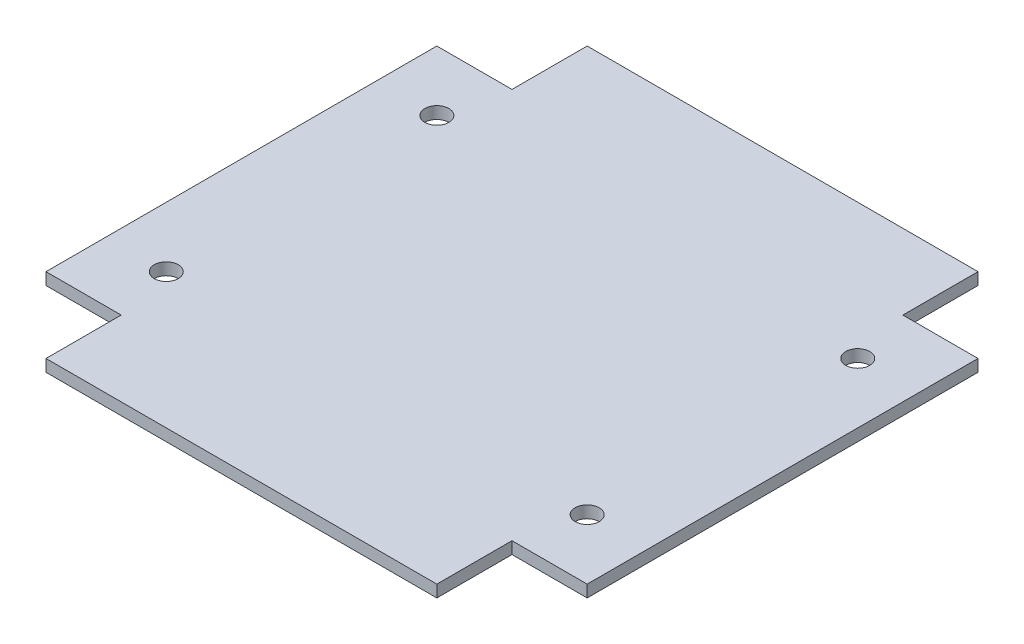
ISO-10303-21;
HEADER;
FILE_DESCRIPTION(('STEP AP214'),'2;1');
FILE_NAME('part.step','',(''),(''),'','','');
FILE_SCHEMA(('AUTOMOTIVE_DESIGN { 1 0 10303 214 1 1 1 1 }'));
ENDSEC;
DATA;
#1=APPLICATION_CONTEXT('core data for automotive mechanical design processes');
#2=APPLICATION_PROTOCOL_DEFINITION('international standard','automotive_design',2000,#1);
#3=PRODUCT_CONTEXT('',#1,'mechanical');
#4=PRODUCT('Part','Part','',(#3));
#5=PRODUCT_RELATED_PRODUCT_CATEGORY('part','',(#4));
#6=PRODUCT_DEFINITION_FORMATION('','',#4);
#7=PRODUCT_DEFINITION_CONTEXT('part definition',#1,'design');
#8=PRODUCT_DEFINITION('design','',#6,#7);
#9=PRODUCT_DEFINITION_SHAPE('','',#8);
#10=(LENGTH_UNIT() NAMED_UNIT(*) SI_UNIT(.MILLI.,.METRE.));
#11=(NAMED_UNIT(*) PLANE_ANGLE_UNIT() SI_UNIT($,.RADIAN.));
#12=(NAMED_UNIT(*) SI_UNIT($,.STERADIAN.) SOLID_ANGLE_UNIT());
#13=UNCERTAINTY_MEASURE_WITH_UNIT(LENGTH_MEASURE(1.E-05),#10,'distance_accuracy_value','');
#14=(GEOMETRIC_REPRESENTATION_CONTEXT(3) GLOBAL_UNCERTAINTY_ASSIGNED_CONTEXT((#13)) GLOBAL_UNIT_ASSIGNED_CONTEXT((#10,
#11,#12)) REPRESENTATION_CONTEXT('',''));
#15=CARTESIAN_POINT('',(0.,0.,0.));
#16=DIRECTION('',(0.,0.,1.));
#17=DIRECTION('',(1.,0.,0.));
#18=AXIS2_PLACEMENT_3D('',#15,#16,#17);
#19=CARTESIAN_POINT('',(0.,2.,0.));
#20=DIRECTION('',(0.,-1.,0.));
#21=DIRECTION('',(0.,0.,-1.));
#22=AXIS2_PLACEMENT_3D('',#19,#20,#21);
#23=PLANE('',#22);
#24=CARTESIAN_POINT('',(26.0294117647059,2.,-25.1102941176471));
#25=DIRECTION('',(0.,1.,0.));
#26=DIRECTION('',(0.,0.,1.));
#27=AXIS2_PLACEMENT_3D('',#24,#25,#26);
#28=CIRCLE('',#27,1.99999999999999);
#29=CARTESIAN_POINT('',(26.0294117647059,2.,-23.1102941176471));
#30=VERTEX_POINT('',#29);
#31=EDGE_CURVE('E289',#30,#30,#28,.T.);
#32=ORIENTED_EDGE('',*,*,#31,.F.);
#33=EDGE_LOOP('',(#32));
#34=FACE_BOUND('',#33,.T.);
#35=CARTESIAN_POINT('',(-43.9705882352941,2.,19.8897058823529));
#36=DIRECTION('',(0.,1.,0.));
#37=DIRECTION('',(0.,0.,1.));
#38=AXIS2_PLACEMENT_3D('',#35,#36,#37);
#39=CIRCLE('',#38,1.99999999999999);
#40=CARTESIAN_POINT('',(-43.9705882352941,2.,21.8897058823529));
#41=VERTEX_POINT('',#40);
#42=EDGE_CURVE('E297',#41,#41,#39,.T.);
#43=ORIENTED_EDGE('',*,*,#42,.F.);
#44=EDGE_LOOP('',(#43));
#45=FACE_BOUND('',#44,.T.);
#46=CARTESIAN_POINT('',(26.0294117647059,2.,19.8897058823529));
#47=DIRECTION('',(0.,1.,0.));
#48=DIRECTION('',(0.,0.,1.));
#49=AXIS2_PLACEMENT_3D('',#46,#47,#48);
#50=CIRCLE('',#49,1.99999999999999);
#51=CARTESIAN_POINT('',(26.0294117647059,2.,21.8897058823529));
#52=VERTEX_POINT('',#51);
#53=EDGE_CURVE('E303',#52,#52,#50,.T.);
#54=ORIENTED_EDGE('',*,*,#53,.F.);
#55=EDGE_LOOP('',(#54));
#56=FACE_BOUND('',#55,.T.);
#57=DIRECTION('',(0.,0.,1.));
#58=VECTOR('',#57,1.);
#59=CARTESIAN_POINT('',(-53.9705882352941,2.,29.8897058823529));
#60=LINE('',#59,#58);
#61=CARTESIAN_POINT('',(-53.9705882352941,2.,-35.1102941176471));
#62=VERTEX_POINT('',#61);
#63=CARTESIAN_POINT('',(-53.9705882352941,2.,29.8897058823529));
#64=VERTEX_POINT('',#63);
#65=EDGE_CURVE('E177',#62,#64,#60,.T.);
#66=ORIENTED_EDGE('',*,*,#65,.T.);
#67=DIRECTION('',(1.,0.,0.));
#68=VECTOR('',#67,1.);
#69=CARTESIAN_POINT('',(-41.4705882352941,2.,29.8897058823529));
#70=LINE('',#69,#68);
#71=CARTESIAN_POINT('',(-41.4705882352941,2.,29.8897058823529));
#72=VERTEX_POINT('',#71);
#73=EDGE_CURVE('E105',#64,#72,#70,.T.);
#74=ORIENTED_EDGE('',*,*,#73,.T.);
#75=DIRECTION('',(0.,0.,1.));
#76=VECTOR('',#75,1.);
#77=CARTESIAN_POINT('',(-41.4705882352941,2.,42.3897058823529));
#78=LINE('',#77,#76);
#79=CARTESIAN_POINT('',(-41.4705882352941,2.,42.3897058823529));
#80=VERTEX_POINT('',#79);
#81=EDGE_CURVE('E204',#72,#80,#78,.T.);
#82=ORIENTED_EDGE('',*,*,#81,.T.);
#83=DIRECTION('',(1.,0.,0.));
#84=VECTOR('',#83,1.);
#85=CARTESIAN_POINT('',(23.5294117647059,2.,42.3897058823529));
#86=LINE('',#85,#84);
#87=CARTESIAN_POINT('',(23.5294117647059,2.,42.3897058823529));
#88=VERTEX_POINT('',#87);
#89=EDGE_CURVE('E222',#80,#88,#86,.T.);
#90=ORIENTED_EDGE('',*,*,#89,.T.);
#91=DIRECTION('',(0.,0.,-1.));
#92=VECTOR('',#91,1.);
#93=CARTESIAN_POINT('',(23.5294117647059,2.,29.8897058823529));
#94=LINE('',#93,#92);
#95=CARTESIAN_POINT('',(23.5294117647059,2.,29.8897058823529));
#96=VERTEX_POINT('',#95);
#97=EDGE_CURVE('E219',#88,#96,#94,.T.);
#98=ORIENTED_EDGE('',*,*,#97,.T.);
#99=DIRECTION('',(1.,0.,0.));
#100=VECTOR('',#99,1.);
#101=CARTESIAN_POINT('',(36.0294117647059,2.,29.8897058823529));
#102=LINE('',#101,#100);
#103=CARTESIAN_POINT('',(36.0294117647059,2.,29.8897058823529));
#104=VERTEX_POINT('',#103);
#105=EDGE_CURVE('E221',#96,#104,#102,.T.);
#106=ORIENTED_EDGE('',*,*,#105,.T.);
#107=DIRECTION('',(0.,0.,-1.));
#108=VECTOR('',#107,1.);
#109=CARTESIAN_POINT('',(36.0294117647059,2.,-35.1102941176471));
#110=LINE('',#109,#108);
#111=CARTESIAN_POINT('',(36.0294117647059,2.,-35.1102941176471));
#112=VERTEX_POINT('',#111);
#113=EDGE_CURVE('E224',#104,#112,#110,.T.);
#114=ORIENTED_EDGE('',*,*,#113,.T.);
#115=DIRECTION('',(-1.,0.,0.));
#116=VECTOR('',#115,1.);
#117=CARTESIAN_POINT('',(23.5294117647059,2.,-35.1102941176471));
#118=LINE('',#117,#116);
#119=CARTESIAN_POINT('',(23.5294117647059,2.,-35.1102941176471));
#120=VERTEX_POINT('',#119);
#121=EDGE_CURVE('E230',#112,#120,#118,.T.);
#122=ORIENTED_EDGE('',*,*,#121,.T.);
#123=DIRECTION('',(0.,0.,-1.));
#124=VECTOR('',#123,1.);
#125=CARTESIAN_POINT('',(23.5294117647059,2.,-47.6102941176471));
#126=LINE('',#125,#124);
#127=CARTESIAN_POINT('',(23.5294117647059,2.,-47.6102941176471));
#128=VERTEX_POINT('',#127);
#129=EDGE_CURVE('E136',#120,#128,#126,.T.);
#130=ORIENTED_EDGE('',*,*,#129,.T.);
#131=DIRECTION('',(-1.,0.,0.));
#132=VECTOR('',#131,1.);
#133=CARTESIAN_POINT('',(-41.4705882352941,2.,-47.6102941176471));
#134=LINE('',#133,#132);
#135=CARTESIAN_POINT('',(-41.4705882352941,2.,-47.6102941176471));
#136=VERTEX_POINT('',#135);
#137=EDGE_CURVE('E130',#128,#136,#134,.T.);
#138=ORIENTED_EDGE('',*,*,#137,.T.);
#139=DIRECTION('',(0.,0.,1.));
#140=VECTOR('',#139,1.);
#141=CARTESIAN_POINT('',(-41.4705882352941,2.,-35.1102941176471));
#142=LINE('',#141,#140);
#143=CARTESIAN_POINT('',(-41.4705882352941,2.,-35.1102941176471));
#144=VERTEX_POINT('',#143);
#145=EDGE_CURVE('E134',#136,#144,#142,.T.);
#146=ORIENTED_EDGE('',*,*,#145,.T.);
#147=DIRECTION('',(-1.,0.,0.));
#148=VECTOR('',#147,1.);
#149=CARTESIAN_POINT('',(-53.9705882352941,2.,-35.1102941176471));
#150=LINE('',#149,#148);
#151=EDGE_CURVE('E50',#144,#62,#150,.T.);
#152=ORIENTED_EDGE('',*,*,#151,.T.);
#153=EDGE_LOOP('',(#66,#74,#82,#90,#98,#106,#114,#122,#130,#138,#146,#152));
#154=FACE_BOUND('',#153,.T.);
#155=CARTESIAN_POINT('',(-43.9705882352941,2.,-25.1102941176471));
#156=DIRECTION('',(0.,1.,0.));
#157=DIRECTION('',(0.,0.,1.));
#158=AXIS2_PLACEMENT_3D('',#155,#156,#157);
#159=CIRCLE('',#158,1.99999999999999);
#160=CARTESIAN_POINT('',(-43.9705882352941,2.,-23.1102941176471));
#161=VERTEX_POINT('',#160);
#162=EDGE_CURVE('E287',#161,#161,#159,.T.);
#163=ORIENTED_EDGE('',*,*,#162,.F.);
#164=EDGE_LOOP('',(#163));
#165=FACE_BOUND('',#164,.T.);
#166=ADVANCED_FACE('F33',(#34,#45,#56,#154,#165),#23,.F.);
#167=CARTESIAN_POINT('',(-53.9705882352941,2.,29.8897058823529));
#168=DIRECTION('',(1.,0.,0.));
#169=DIRECTION('',(0.,0.,-1.));
#170=AXIS2_PLACEMENT_3D('',#167,#168,#169);
#171=PLANE('',#170);
#172=DIRECTION('',(0.,0.,1.));
#173=VECTOR('',#172,1.);
#174=CARTESIAN_POINT('',(-53.9705882352941,0.,29.8897058823529));
#175=LINE('',#174,#173);
#176=CARTESIAN_POINT('',(-53.9705882352941,0.,-35.1102941176471));
#177=VERTEX_POINT('',#176);
#178=CARTESIAN_POINT('',(-53.9705882352941,0.,29.8897058823529));
#179=VERTEX_POINT('',#178);
#180=EDGE_CURVE('E154',#177,#179,#175,.T.);
#181=ORIENTED_EDGE('',*,*,#180,.T.);
#182=DIRECTION('',(0.,-1.,0.));
#183=VECTOR('',#182,1.);
#184=CARTESIAN_POINT('',(-53.9705882352941,2.,29.8897058823529));
#185=LINE('',#184,#183);
#186=EDGE_CURVE('E11',#64,#179,#185,.T.);
#187=ORIENTED_EDGE('',*,*,#186,.F.);
#188=ORIENTED_EDGE('',*,*,#65,.F.);
#189=DIRECTION('',(0.,-1.,0.));
#190=VECTOR('',#189,1.);
#191=CARTESIAN_POINT('',(-53.9705882352941,2.,-35.1102941176471));
#192=LINE('',#191,#190);
#193=EDGE_CURVE('E150',#62,#177,#192,.T.);
#194=ORIENTED_EDGE('',*,*,#193,.T.);
#195=EDGE_LOOP('',(#181,#187,#188,#194));
#196=FACE_BOUND('',#195,.T.);
#197=ADVANCED_FACE('F35',(#196),#171,.F.);
#198=CARTESIAN_POINT('',(-41.4705882352941,2.,29.8897058823529));
#199=DIRECTION('',(0.,0.,-1.));
#200=DIRECTION('',(-1.,0.,0.));
#201=AXIS2_PLACEMENT_3D('',#198,#199,#200);
#202=PLANE('',#201);
#203=DIRECTION('',(1.,0.,0.));
#204=VECTOR('',#203,1.);
#205=CARTESIAN_POINT('',(-41.4705882352941,0.,29.8897058823529));
#206=LINE('',#205,#204);
#207=CARTESIAN_POINT('',(-41.4705882352941,0.,29.8897058823529));
#208=VERTEX_POINT('',#207);
#209=EDGE_CURVE('E157',#179,#208,#206,.T.);
#210=ORIENTED_EDGE('',*,*,#209,.T.);
#211=DIRECTION('',(0.,-1.,0.));
#212=VECTOR('',#211,1.);
#213=CARTESIAN_POINT('',(-41.4705882352941,2.,29.8897058823529));
#214=LINE('',#213,#212);
#215=EDGE_CURVE('E42',#72,#208,#214,.T.);
#216=ORIENTED_EDGE('',*,*,#215,.F.);
#217=ORIENTED_EDGE('',*,*,#73,.F.);
#218=ORIENTED_EDGE('',*,*,#186,.T.);
#219=EDGE_LOOP('',(#210,#216,#217,#218));
#220=FACE_BOUND('',#219,.T.);
#221=ADVANCED_FACE('F261',(#220),#202,.F.);
#222=CARTESIAN_POINT('',(-41.4705882352941,2.,42.3897058823529));
#223=DIRECTION('',(1.,0.,0.));
#224=DIRECTION('',(0.,0.,-1.));
#225=AXIS2_PLACEMENT_3D('',#222,#223,#224);
#226=PLANE('',#225);
#227=DIRECTION('',(0.,0.,1.));
#228=VECTOR('',#227,1.);
#229=CARTESIAN_POINT('',(-41.4705882352941,0.,42.3897058823529));
#230=LINE('',#229,#228);
#231=CARTESIAN_POINT('',(-41.4705882352941,0.,42.3897058823529));
#232=VERTEX_POINT('',#231);
#233=EDGE_CURVE('E160',#208,#232,#230,.T.);
#234=ORIENTED_EDGE('',*,*,#233,.T.);
#235=DIRECTION('',(0.,-1.,0.));
#236=VECTOR('',#235,1.);
#237=CARTESIAN_POINT('',(-41.4705882352941,2.,42.3897058823529));
#238=LINE('',#237,#236);
#239=EDGE_CURVE('E196',#80,#232,#238,.T.);
#240=ORIENTED_EDGE('',*,*,#239,.F.);
#241=ORIENTED_EDGE('',*,*,#81,.F.);
#242=ORIENTED_EDGE('',*,*,#215,.T.);
#243=EDGE_LOOP('',(#234,#240,#241,#242));
#244=FACE_BOUND('',#243,.T.);
#245=ADVANCED_FACE('F202',(#244),#226,.F.);
#246=CARTESIAN_POINT('',(23.5294117647059,2.,42.3897058823529));
#247=DIRECTION('',(0.,0.,-1.));
#248=DIRECTION('',(-1.,0.,0.));
#249=AXIS2_PLACEMENT_3D('',#246,#247,#248);
#250=PLANE('',#249);
#251=DIRECTION('',(1.,0.,0.));
#252=VECTOR('',#251,1.);
#253=CARTESIAN_POINT('',(23.5294117647059,0.,42.3897058823529));
#254=LINE('',#253,#252);
#255=CARTESIAN_POINT('',(23.5294117647059,0.,42.3897058823529));
#256=VERTEX_POINT('',#255);
#257=EDGE_CURVE('E162',#232,#256,#254,.T.);
#258=ORIENTED_EDGE('',*,*,#257,.T.);
#259=DIRECTION('',(0.,-1.,0.));
#260=VECTOR('',#259,1.);
#261=CARTESIAN_POINT('',(23.5294117647059,2.,42.3897058823529));
#262=LINE('',#261,#260);
#263=EDGE_CURVE('E193',#88,#256,#262,.T.);
#264=ORIENTED_EDGE('',*,*,#263,.F.);
#265=ORIENTED_EDGE('',*,*,#89,.F.);
#266=ORIENTED_EDGE('',*,*,#239,.T.);
#267=EDGE_LOOP('',(#258,#264,#265,#266));
#268=FACE_BOUND('',#267,.T.);
#269=ADVANCED_FACE('F213',(#268),#250,.F.);
#270=CARTESIAN_POINT('',(23.5294117647059,2.,29.8897058823529));
#271=DIRECTION('',(-1.,0.,0.));
#272=DIRECTION('',(0.,0.,1.));
#273=AXIS2_PLACEMENT_3D('',#270,#271,#272);
#274=PLANE('',#273);
#275=DIRECTION('',(0.,0.,-1.));
#276=VECTOR('',#275,1.);
#277=CARTESIAN_POINT('',(23.5294117647059,0.,29.8897058823529));
#278=LINE('',#277,#276);
#279=CARTESIAN_POINT('',(23.5294117647059,0.,29.8897058823529));
#280=VERTEX_POINT('',#279);
#281=EDGE_CURVE('E164',#256,#280,#278,.T.);
#282=ORIENTED_EDGE('',*,*,#281,.T.);
#283=DIRECTION('',(0.,-1.,0.));
#284=VECTOR('',#283,1.);
#285=CARTESIAN_POINT('',(23.5294117647059,2.,29.8897058823529));
#286=LINE('',#285,#284);
#287=EDGE_CURVE('E190',#96,#280,#286,.T.);
#288=ORIENTED_EDGE('',*,*,#287,.F.);
#289=ORIENTED_EDGE('',*,*,#97,.F.);
#290=ORIENTED_EDGE('',*,*,#263,.T.);
#291=EDGE_LOOP('',(#282,#288,#289,#290));
#292=FACE_BOUND('',#291,.T.);
#293=ADVANCED_FACE('F217',(#292),#274,.F.);
#294=CARTESIAN_POINT('',(36.0294117647059,2.,29.8897058823529));
#295=DIRECTION('',(0.,0.,-1.));
#296=DIRECTION('',(-1.,0.,0.));
#297=AXIS2_PLACEMENT_3D('',#294,#295,#296);
#298=PLANE('',#297);
#299=DIRECTION('',(1.,0.,0.));
#300=VECTOR('',#299,1.);
#301=CARTESIAN_POINT('',(36.0294117647059,0.,29.8897058823529));
#302=LINE('',#301,#300);
#303=CARTESIAN_POINT('',(36.0294117647059,0.,29.8897058823529));
#304=VERTEX_POINT('',#303);
#305=EDGE_CURVE('E166',#280,#304,#302,.T.);
#306=ORIENTED_EDGE('',*,*,#305,.T.);
#307=DIRECTION('',(0.,-1.,0.));
#308=VECTOR('',#307,1.);
#309=CARTESIAN_POINT('',(36.0294117647059,2.,29.8897058823529));
#310=LINE('',#309,#308);
#311=EDGE_CURVE('E187',#104,#304,#310,.T.);
#312=ORIENTED_EDGE('',*,*,#311,.F.);
#313=ORIENTED_EDGE('',*,*,#105,.F.);
#314=ORIENTED_EDGE('',*,*,#287,.T.);
#315=EDGE_LOOP('',(#306,#312,#313,#314));
#316=FACE_BOUND('',#315,.T.);
#317=ADVANCED_FACE('F385',(#316),#298,.F.);
#318=CARTESIAN_POINT('',(36.0294117647059,2.,-35.1102941176471));
#319=DIRECTION('',(-1.,0.,0.));
#320=DIRECTION('',(0.,0.,1.));
#321=AXIS2_PLACEMENT_3D('',#318,#319,#320);
#322=PLANE('',#321);
#323=DIRECTION('',(0.,0.,-1.));
#324=VECTOR('',#323,1.);
#325=CARTESIAN_POINT('',(36.0294117647059,0.,-35.1102941176471));
#326=LINE('',#325,#324);
#327=CARTESIAN_POINT('',(36.0294117647059,0.,-35.1102941176471));
#328=VERTEX_POINT('',#327);
#329=EDGE_CURVE('E168',#304,#328,#326,.T.);
#330=ORIENTED_EDGE('',*,*,#329,.T.);
#331=DIRECTION('',(0.,-1.,0.));
#332=VECTOR('',#331,1.);
#333=CARTESIAN_POINT('',(36.0294117647059,2.,-35.1102941176471));
#334=LINE('',#333,#332);
#335=EDGE_CURVE('E184',#112,#328,#334,.T.);
#336=ORIENTED_EDGE('',*,*,#335,.F.);
#337=ORIENTED_EDGE('',*,*,#113,.F.);
#338=ORIENTED_EDGE('',*,*,#311,.T.);
#339=EDGE_LOOP('',(#330,#336,#337,#338));
#340=FACE_BOUND('',#339,.T.);
#341=ADVANCED_FACE('F376',(#340),#322,.F.);
#342=CARTESIAN_POINT('',(23.5294117647059,2.,-35.1102941176471));
#343=DIRECTION('',(0.,0.,1.));
#344=DIRECTION('',(1.,0.,0.));
#345=AXIS2_PLACEMENT_3D('',#342,#343,#344);
#346=PLANE('',#345);
#347=DIRECTION('',(-1.,0.,0.));
#348=VECTOR('',#347,1.);
#349=CARTESIAN_POINT('',(23.5294117647059,0.,-35.1102941176471));
#350=LINE('',#349,#348);
#351=CARTESIAN_POINT('',(23.5294117647059,0.,-35.1102941176471));
#352=VERTEX_POINT('',#351);
#353=EDGE_CURVE('E170',#328,#352,#350,.T.);
#354=ORIENTED_EDGE('',*,*,#353,.T.);
#355=DIRECTION('',(0.,-1.,0.));
#356=VECTOR('',#355,1.);
#357=CARTESIAN_POINT('',(23.5294117647059,2.,-35.1102941176471));
#358=LINE('',#357,#356);
#359=EDGE_CURVE('E181',#120,#352,#358,.T.);
#360=ORIENTED_EDGE('',*,*,#359,.F.);
#361=ORIENTED_EDGE('',*,*,#121,.F.);
#362=ORIENTED_EDGE('',*,*,#335,.T.);
#363=EDGE_LOOP('',(#354,#360,#361,#362));
#364=FACE_BOUND('',#363,.T.);
#365=ADVANCED_FACE('F236',(#364),#346,.F.);
#366=CARTESIAN_POINT('',(23.5294117647059,2.,-47.6102941176471));
#367=DIRECTION('',(-1.,0.,0.));
#368=DIRECTION('',(0.,0.,1.));
#369=AXIS2_PLACEMENT_3D('',#366,#367,#368);
#370=PLANE('',#369);
#371=DIRECTION('',(0.,0.,-1.));
#372=VECTOR('',#371,1.);
#373=CARTESIAN_POINT('',(23.5294117647059,0.,-47.6102941176471));
#374=LINE('',#373,#372);
#375=CARTESIAN_POINT('',(23.5294117647059,0.,-47.6102941176471));
#376=VERTEX_POINT('',#375);
#377=EDGE_CURVE('E172',#352,#376,#374,.T.);
#378=ORIENTED_EDGE('',*,*,#377,.T.);
#379=DIRECTION('',(0.,-1.,0.));
#380=VECTOR('',#379,1.);
#381=CARTESIAN_POINT('',(23.5294117647059,2.,-47.6102941176471));
#382=LINE('',#381,#380);
#383=EDGE_CURVE('E145',#128,#376,#382,.T.);
#384=ORIENTED_EDGE('',*,*,#383,.F.);
#385=ORIENTED_EDGE('',*,*,#129,.F.);
#386=ORIENTED_EDGE('',*,*,#359,.T.);
#387=EDGE_LOOP('',(#378,#384,#385,#386));
#388=FACE_BOUND('',#387,.T.);
#389=ADVANCED_FACE('F240',(#388),#370,.F.);
#390=CARTESIAN_POINT('',(-41.4705882352941,2.,-47.6102941176471));
#391=DIRECTION('',(0.,0.,1.));
#392=DIRECTION('',(1.,0.,0.));
#393=AXIS2_PLACEMENT_3D('',#390,#391,#392);
#394=PLANE('',#393);
#395=DIRECTION('',(-1.,0.,0.));
#396=VECTOR('',#395,1.);
#397=CARTESIAN_POINT('',(-41.4705882352941,0.,-47.6102941176471));
#398=LINE('',#397,#396);
#399=CARTESIAN_POINT('',(-41.4705882352941,0.,-47.6102941176471));
#400=VERTEX_POINT('',#399);
#401=EDGE_CURVE('E144',#376,#400,#398,.T.);
#402=ORIENTED_EDGE('',*,*,#401,.T.);
#403=DIRECTION('',(0.,-1.,0.));
#404=VECTOR('',#403,1.);
#405=CARTESIAN_POINT('',(-41.4705882352941,2.,-47.6102941176471));
#406=LINE('',#405,#404);
#407=EDGE_CURVE('E141',#136,#400,#406,.T.);
#408=ORIENTED_EDGE('',*,*,#407,.F.);
#409=ORIENTED_EDGE('',*,*,#137,.F.);
#410=ORIENTED_EDGE('',*,*,#383,.T.);
#411=EDGE_LOOP('',(#402,#408,#409,#410));
#412=FACE_BOUND('',#411,.T.);
#413=ADVANCED_FACE('F142',(#412),#394,.F.);
#414=CARTESIAN_POINT('',(-41.4705882352941,2.,-35.1102941176471));
#415=DIRECTION('',(1.,0.,0.));
#416=DIRECTION('',(0.,0.,-1.));
#417=AXIS2_PLACEMENT_3D('',#414,#415,#416);
#418=PLANE('',#417);
#419=DIRECTION('',(0.,0.,1.));
#420=VECTOR('',#419,1.);
#421=CARTESIAN_POINT('',(-41.4705882352941,0.,-35.1102941176471));
#422=LINE('',#421,#420);
#423=CARTESIAN_POINT('',(-41.4705882352941,0.,-35.1102941176471));
#424=VERTEX_POINT('',#423);
#425=EDGE_CURVE('E91',#400,#424,#422,.T.);
#426=ORIENTED_EDGE('',*,*,#425,.T.);
#427=DIRECTION('',(0.,-1.,0.));
#428=VECTOR('',#427,1.);
#429=CARTESIAN_POINT('',(-41.4705882352941,2.,-35.1102941176471));
#430=LINE('',#429,#428);
#431=EDGE_CURVE('E146',#144,#424,#430,.T.);
#432=ORIENTED_EDGE('',*,*,#431,.F.);
#433=ORIENTED_EDGE('',*,*,#145,.F.);
#434=ORIENTED_EDGE('',*,*,#407,.T.);
#435=EDGE_LOOP('',(#426,#432,#433,#434));
#436=FACE_BOUND('',#435,.T.);
#437=ADVANCED_FACE('F148',(#436),#418,.F.);
#438=CARTESIAN_POINT('',(-53.9705882352941,2.,-35.1102941176471));
#439=DIRECTION('',(0.,0.,1.));
#440=DIRECTION('',(1.,0.,0.));
#441=AXIS2_PLACEMENT_3D('',#438,#439,#440);
#442=PLANE('',#441);
#443=DIRECTION('',(-1.,0.,0.));
#444=VECTOR('',#443,1.);
#445=CARTESIAN_POINT('',(-53.9705882352941,0.,-35.1102941176471));
#446=LINE('',#445,#444);
#447=EDGE_CURVE('E97',#424,#177,#446,.T.);
#448=ORIENTED_EDGE('',*,*,#447,.T.);
#449=ORIENTED_EDGE('',*,*,#193,.F.);
#450=ORIENTED_EDGE('',*,*,#151,.F.);
#451=ORIENTED_EDGE('',*,*,#431,.T.);
#452=EDGE_LOOP('',(#448,#449,#450,#451));
#453=FACE_BOUND('',#452,.T.);
#454=ADVANCED_FACE('F244',(#453),#442,.F.);
#455=CARTESIAN_POINT('',(0.,0.,0.));
#456=DIRECTION('',(0.,-1.,0.));
#457=DIRECTION('',(0.,0.,-1.));
#458=AXIS2_PLACEMENT_3D('',#455,#456,#457);
#459=PLANE('',#458);
#460=CARTESIAN_POINT('',(-43.9705882352941,0.,-25.1102941176471));
#461=DIRECTION('',(0.,1.,0.));
#462=DIRECTION('',(0.,0.,1.));
#463=AXIS2_PLACEMENT_3D('',#460,#461,#462);
#464=CIRCLE('',#463,2.);
#465=CARTESIAN_POINT('',(-43.9705882352941,0.,-23.1102941176471));
#466=VERTEX_POINT('',#465);
#467=EDGE_CURVE('E284',#466,#466,#464,.T.);
#468=ORIENTED_EDGE('',*,*,#467,.T.);
#469=EDGE_LOOP('',(#468));
#470=FACE_BOUND('',#469,.T.);
#471=CARTESIAN_POINT('',(26.0294117647059,0.,-25.1102941176471));
#472=DIRECTION('',(0.,1.,0.));
#473=DIRECTION('',(0.,0.,1.));
#474=AXIS2_PLACEMENT_3D('',#471,#472,#473);
#475=CIRCLE('',#474,2.);
#476=CARTESIAN_POINT('',(26.0294117647059,0.,-23.1102941176471));
#477=VERTEX_POINT('',#476);
#478=EDGE_CURVE('E294',#477,#477,#475,.T.);
#479=ORIENTED_EDGE('',*,*,#478,.T.);
#480=EDGE_LOOP('',(#479));
#481=FACE_BOUND('',#480,.T.);
#482=CARTESIAN_POINT('',(-43.9705882352941,0.,19.8897058823529));
#483=DIRECTION('',(0.,1.,0.));
#484=DIRECTION('',(0.,0.,1.));
#485=AXIS2_PLACEMENT_3D('',#482,#483,#484);
#486=CIRCLE('',#485,2.);
#487=CARTESIAN_POINT('',(-43.9705882352941,0.,21.8897058823529));
#488=VERTEX_POINT('',#487);
#489=EDGE_CURVE('E300',#488,#488,#486,.T.);
#490=ORIENTED_EDGE('',*,*,#489,.T.);
#491=EDGE_LOOP('',(#490));
#492=FACE_BOUND('',#491,.T.);
#493=CARTESIAN_POINT('',(26.0294117647059,0.,19.8897058823529));
#494=DIRECTION('',(0.,1.,0.));
#495=DIRECTION('',(0.,0.,1.));
#496=AXIS2_PLACEMENT_3D('',#493,#494,#495);
#497=CIRCLE('',#496,2.);
#498=CARTESIAN_POINT('',(26.0294117647059,0.,21.8897058823529));
#499=VERTEX_POINT('',#498);
#500=EDGE_CURVE('E158',#499,#499,#497,.T.);
#501=ORIENTED_EDGE('',*,*,#500,.T.);
#502=EDGE_LOOP('',(#501));
#503=FACE_BOUND('',#502,.T.);
#504=ORIENTED_EDGE('',*,*,#180,.F.);
#505=ORIENTED_EDGE('',*,*,#447,.F.);
#506=ORIENTED_EDGE('',*,*,#425,.F.);
#507=ORIENTED_EDGE('',*,*,#401,.F.);
#508=ORIENTED_EDGE('',*,*,#377,.F.);
#509=ORIENTED_EDGE('',*,*,#353,.F.);
#510=ORIENTED_EDGE('',*,*,#329,.F.);
#511=ORIENTED_EDGE('',*,*,#305,.F.);
#512=ORIENTED_EDGE('',*,*,#281,.F.);
#513=ORIENTED_EDGE('',*,*,#257,.F.);
#514=ORIENTED_EDGE('',*,*,#233,.F.);
#515=ORIENTED_EDGE('',*,*,#209,.F.);
#516=EDGE_LOOP('',(#504,#505,#506,#507,#508,#509,#510,#511,#512,#513,#514,#515));
#517=FACE_BOUND('',#516,.T.);
#518=ADVANCED_FACE('F208',(#470,#481,#492,#503,#517),#459,.T.);
#519=CARTESIAN_POINT('',(26.0294117647059,2.,19.8897058823529));
#520=DIRECTION('',(0.,1.,0.));
#521=DIRECTION('',(0.,0.,1.));
#522=AXIS2_PLACEMENT_3D('',#519,#520,#521);
#523=CYLINDRICAL_SURFACE('',#522,1.99999999999999);
#524=ORIENTED_EDGE('',*,*,#500,.F.);
#525=EDGE_LOOP('',(#524));
#526=FACE_BOUND('',#525,.T.);
#527=ORIENTED_EDGE('',*,*,#53,.T.);
#528=EDGE_LOOP('',(#527));
#529=FACE_BOUND('',#528,.T.);
#530=ADVANCED_FACE('F251',(#526,#529),#523,.F.);
#531=CARTESIAN_POINT('',(-43.9705882352941,2.,19.8897058823529));
#532=DIRECTION('',(0.,1.,0.));
#533=DIRECTION('',(0.,0.,1.));
#534=AXIS2_PLACEMENT_3D('',#531,#532,#533);
#535=CYLINDRICAL_SURFACE('',#534,1.99999999999999);
#536=ORIENTED_EDGE('',*,*,#489,.F.);
#537=EDGE_LOOP('',(#536));
#538=FACE_BOUND('',#537,.T.);
#539=ORIENTED_EDGE('',*,*,#42,.T.);
#540=EDGE_LOOP('',(#539));
#541=FACE_BOUND('',#540,.T.);
#542=ADVANCED_FACE('F267',(#538,#541),#535,.F.);
#543=CARTESIAN_POINT('',(26.0294117647059,2.,-25.1102941176471));
#544=DIRECTION('',(0.,1.,0.));
#545=DIRECTION('',(0.,0.,1.));
#546=AXIS2_PLACEMENT_3D('',#543,#544,#545);
#547=CYLINDRICAL_SURFACE('',#546,1.99999999999999);
#548=ORIENTED_EDGE('',*,*,#478,.F.);
#549=EDGE_LOOP('',(#548));
#550=FACE_BOUND('',#549,.T.);
#551=ORIENTED_EDGE('',*,*,#31,.T.);
#552=EDGE_LOOP('',(#551));
#553=FACE_BOUND('',#552,.T.);
#554=ADVANCED_FACE('F271',(#550,#553),#547,.F.);
#555=CARTESIAN_POINT('',(-43.9705882352941,2.,-25.1102941176471));
#556=DIRECTION('',(0.,1.,0.));
#557=DIRECTION('',(0.,0.,1.));
#558=AXIS2_PLACEMENT_3D('',#555,#556,#557);
#559=CYLINDRICAL_SURFACE('',#558,1.99999999999999);
#560=ORIENTED_EDGE('',*,*,#467,.F.);
#561=EDGE_LOOP('',(#560));
#562=FACE_BOUND('',#561,.T.);
#563=ORIENTED_EDGE('',*,*,#162,.T.);
#564=EDGE_LOOP('',(#563));
#565=FACE_BOUND('',#564,.T.);
#566=ADVANCED_FACE('F275',(#562,#565),#559,.F.);
#567=CLOSED_SHELL('',(#166,#197,#221,#245,#269,#293,#317,#341,#365,#389,#413,#437,#454,#518,
#530,#542,#554,#566));
#568=MANIFOLD_SOLID_BREP('B2',#567);
#569=ADVANCED_BREP_SHAPE_REPRESENTATION('',(#18,#568),#14);
#570=SHAPE_DEFINITION_REPRESENTATION(#9,#569);
ENDSEC;
END-ISO-10303-21;
